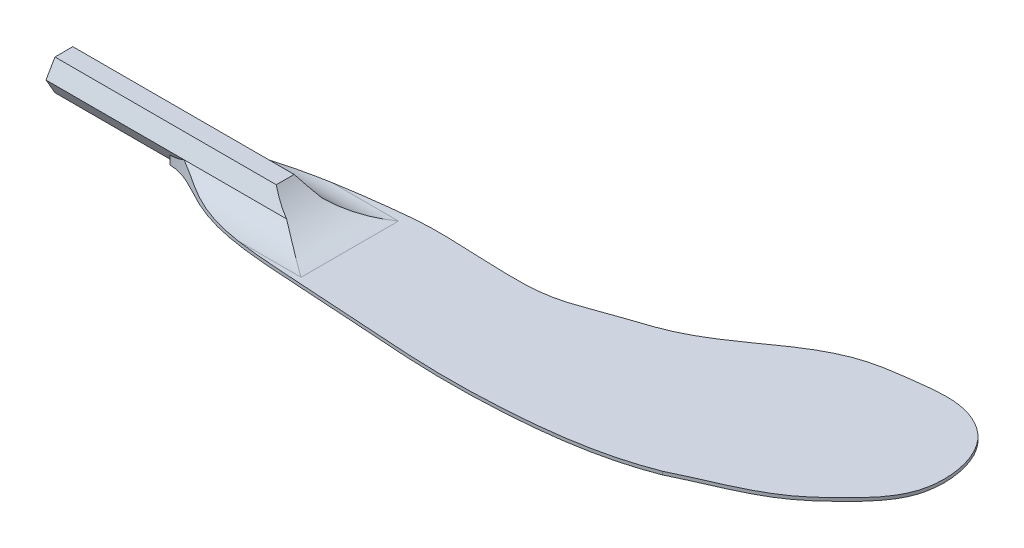
ISO-10303-21;
HEADER;
FILE_DESCRIPTION(('STEP AP214'),'2;1');
FILE_NAME('part.step','',(''),(''),'','','');
FILE_SCHEMA(('AUTOMOTIVE_DESIGN { 1 0 10303 214 1 1 1 1 }'));
ENDSEC;
DATA;
#1=APPLICATION_CONTEXT('core data for automotive mechanical design processes');
#2=APPLICATION_PROTOCOL_DEFINITION('international standard','automotive_design',2000,#1);
#3=PRODUCT_CONTEXT('',#1,'mechanical');
#4=PRODUCT('Part','Part','',(#3));
#5=PRODUCT_RELATED_PRODUCT_CATEGORY('part','',(#4));
#6=PRODUCT_DEFINITION_FORMATION('','',#4);
#7=PRODUCT_DEFINITION_CONTEXT('part definition',#1,'design');
#8=PRODUCT_DEFINITION('design','',#6,#7);
#9=PRODUCT_DEFINITION_SHAPE('','',#8);
#10=(LENGTH_UNIT() NAMED_UNIT(*) SI_UNIT(.MILLI.,.METRE.));
#11=(NAMED_UNIT(*) PLANE_ANGLE_UNIT() SI_UNIT($,.RADIAN.));
#12=(NAMED_UNIT(*) SI_UNIT($,.STERADIAN.) SOLID_ANGLE_UNIT());
#13=UNCERTAINTY_MEASURE_WITH_UNIT(LENGTH_MEASURE(1.E-05),#10,'distance_accuracy_value','');
#14=(GEOMETRIC_REPRESENTATION_CONTEXT(3) GLOBAL_UNCERTAINTY_ASSIGNED_CONTEXT((#13)) GLOBAL_UNIT_ASSIGNED_CONTEXT((#10,
#11,#12)) REPRESENTATION_CONTEXT('',''));
#15=CARTESIAN_POINT('',(0.,0.,0.));
#16=DIRECTION('',(0.,0.,1.));
#17=DIRECTION('',(1.,0.,0.));
#18=AXIS2_PLACEMENT_3D('',#15,#16,#17);
#19=CARTESIAN_POINT('',(3.53291368522627,0.341439542192836,1.55375877546974));
#20=CARTESIAN_POINT('',(5.39941426554257,0.341439542192836,1.64072915160123));
#21=CARTESIAN_POINT('',(7.90143628621617,0.341439542192836,3.36792366022731));
#22=CARTESIAN_POINT('',(12.4204628212514,0.341439542192836,5.12689137095886));
#23=CARTESIAN_POINT('',(17.5429583024821,0.341439542192836,5.88041056402993));
#24=CARTESIAN_POINT('',(23.7272109064526,0.341439542192836,6.19484272639976));
#25=CARTESIAN_POINT('',(30.6743375831285,0.341439542192836,6.66145747400739));
#26=CARTESIAN_POINT('',(38.6993787811437,0.341439542192836,7.24573238124021));
#27=CARTESIAN_POINT('',(49.2665108613436,0.341439542192836,6.98259884214597));
#28=CARTESIAN_POINT('',(57.2028389027666,0.341439542192836,5.81101987603051));
#29=CARTESIAN_POINT('',(61.6938429800198,0.341439542192836,4.05910740886292));
#30=B_SPLINE_CURVE_WITH_KNOTS('',3,(#19,#20,#21,#22,#23,#24,#25,#26,#27,#28,#29),.UNSPECIFIED.,
.F.,.F.,(4,1,1,1,1,1,1,1,4),(0.,0.0900267413271805,0.151645245521543,0.244140319925647,
0.350435716533196,0.465443094241625,0.596636931396752,0.757598930507502,1.),.UNSPECIFIED.);
#31=DIRECTION('',(0.,-1.,0.));
#32=VECTOR('',#31,1.);
#33=SURFACE_OF_LINEAR_EXTRUSION('',#30,#32);
#34=CARTESIAN_POINT('',(3.53291368522627,-0.0185604578071639,1.55375877546974));
#35=CARTESIAN_POINT('',(5.39941426554257,-0.0185604578071639,1.64072915160123));
#36=CARTESIAN_POINT('',(7.90143628621617,-0.0185604578071639,3.36792366022731));
#37=CARTESIAN_POINT('',(12.4204628212514,-0.0185604578071639,5.12689137095886));
#38=CARTESIAN_POINT('',(17.5429583024821,-0.0185604578071639,5.88041056402993));
#39=CARTESIAN_POINT('',(23.7272109064526,-0.0185604578071639,6.19484272639976));
#40=CARTESIAN_POINT('',(30.6743375831285,-0.0185604578071639,6.66145747400739));
#41=CARTESIAN_POINT('',(38.6993787811437,-0.0185604578071639,7.24573238124021));
#42=CARTESIAN_POINT('',(49.2665108613436,-0.0185604578071639,6.98259884214597));
#43=CARTESIAN_POINT('',(57.2028389027666,-0.0185604578071639,5.81101987603051));
#44=CARTESIAN_POINT('',(61.6938429800198,-0.0185604578071639,4.05910740886292));
#45=B_SPLINE_CURVE_WITH_KNOTS('',3,(#34,#35,#36,#37,#38,#39,#40,#41,#42,#43,#44),.UNSPECIFIED.,
.F.,.F.,(4,1,1,1,1,1,1,1,4),(0.,0.0900267413271805,0.151645245521543,0.244140319925647,
0.350435716533196,0.465443094241625,0.596636931396752,0.757598930507502,1.),.UNSPECIFIED.);
#46=CARTESIAN_POINT('',(3.53291368522627,-0.0185604578071639,1.55375877546974));
#47=VERTEX_POINT('',#46);
#48=CARTESIAN_POINT('',(61.6938429800198,-0.0185604578071639,4.05910740886292));
#49=VERTEX_POINT('',#48);
#50=EDGE_CURVE('E304',#47,#49,#45,.T.);
#51=ORIENTED_EDGE('',*,*,#50,.T.);
#52=DIRECTION('',(0.,-1.,0.));
#53=VECTOR('',#52,1.);
#54=CARTESIAN_POINT('',(61.6938429800198,0.341439542192836,4.05910740886292));
#55=LINE('',#54,#53);
#56=CARTESIAN_POINT('',(61.6938429800198,0.341439542192836,4.05910740886292));
#57=VERTEX_POINT('',#56);
#58=EDGE_CURVE('E281',#57,#49,#55,.T.);
#59=ORIENTED_EDGE('',*,*,#58,.F.);
#60=CARTESIAN_POINT('',(3.53291368522627,0.341439542192836,1.55375877546974));
#61=CARTESIAN_POINT('',(5.39941426554257,0.341439542192836,1.64072915160123));
#62=CARTESIAN_POINT('',(7.90143628621617,0.341439542192836,3.36792366022731));
#63=CARTESIAN_POINT('',(12.4204628212514,0.341439542192836,5.12689137095886));
#64=CARTESIAN_POINT('',(17.5429583024821,0.341439542192836,5.88041056402993));
#65=CARTESIAN_POINT('',(23.7272109064526,0.341439542192836,6.19484272639976));
#66=CARTESIAN_POINT('',(30.6743375831285,0.341439542192836,6.66145747400739));
#67=CARTESIAN_POINT('',(38.6993787811437,0.341439542192836,7.24573238124021));
#68=CARTESIAN_POINT('',(49.2665108613436,0.341439542192836,6.98259884214597));
#69=CARTESIAN_POINT('',(57.2028389027666,0.341439542192836,5.81101987603051));
#70=CARTESIAN_POINT('',(61.6938429800198,0.341439542192836,4.05910740886292));
#71=B_SPLINE_CURVE_WITH_KNOTS('',3,(#60,#61,#62,#63,#64,#65,#66,#67,#68,#69,#70),.UNSPECIFIED.,
.F.,.F.,(4,1,1,1,1,1,1,1,4),(0.,0.0900267413271805,0.151645245521543,0.244140319925647,
0.350435716533196,0.465443094241625,0.596636931396752,0.757598930507502,1.),.UNSPECIFIED.);
#72=CARTESIAN_POINT('',(15.1787100310029,0.341439542192836,5.49945586555571));
#73=VERTEX_POINT('',#72);
#74=EDGE_CURVE('E303',#73,#57,#71,.T.);
#75=ORIENTED_EDGE('',*,*,#74,.F.);
#76=CARTESIAN_POINT('',(15.1787100310029,0.341439542192836,5.49945588494075));
#77=CARTESIAN_POINT('',(14.9369451631756,0.34146528144871,5.46312382434842));
#78=CARTESIAN_POINT('',(14.6955381728055,0.341837499258173,5.42424451689249));
#79=CARTESIAN_POINT('',(14.2121798050201,0.343787108050494,5.34035137697904));
#80=CARTESIAN_POINT('',(13.9702351368796,0.345372339265865,5.29529920803922));
#81=CARTESIAN_POINT('',(13.4867027141693,0.350283304427853,5.19827323039414));
#82=CARTESIAN_POINT('',(13.2451205823206,0.353616215614986,5.14627154309321));
#83=CARTESIAN_POINT('',(12.7632167564122,0.362778893452468,5.03459546431482));
#84=CARTESIAN_POINT('',(12.5228988982682,0.368614022930859,4.97490478691018));
#85=CARTESIAN_POINT('',(12.1640959952666,0.379967028911623,4.87911886053269));
#86=CARTESIAN_POINT('',(12.044734085144,0.384186609372266,4.8461364029791));
#87=CARTESIAN_POINT('',(11.806672142105,0.393643330401688,4.77800213366466));
#88=CARTESIAN_POINT('',(11.6879721076803,0.398880468650612,4.74285032684968));
#89=CARTESIAN_POINT('',(11.3393798741714,0.416021395863283,4.63611111005854));
#90=CARTESIAN_POINT('',(11.1104799641424,0.429546366334039,4.56150120669107));
#91=CARTESIAN_POINT('',(10.6562353169275,0.462186656667865,4.404319610403));
#92=CARTESIAN_POINT('',(10.4308855922373,0.481293225673827,4.32176051507684));
#93=CARTESIAN_POINT('',(9.98435888209029,0.526460811213078,4.14891959534867));
#94=CARTESIAN_POINT('',(9.76317452135914,0.552507990081301,4.05865337754663));
#95=CARTESIAN_POINT('',(9.43493804339931,0.597980944627686,3.91767650667825));
#96=CARTESIAN_POINT('',(9.32621053197103,0.614188465170574,3.86979944417612));
#97=CARTESIAN_POINT('',(9.10996105899729,0.648967010393182,3.77220792828809));
#98=CARTESIAN_POINT('',(9.00243909375775,0.667538027828464,3.72249348053437));
#99=CARTESIAN_POINT('',(8.78880420960102,0.707253361554784,3.62135283740014));
#100=CARTESIAN_POINT('',(8.68269009966852,0.728395325443997,3.56992823764429));
#101=CARTESIAN_POINT('',(8.47194150509967,0.773549749283594,3.46534243962358));
#102=CARTESIAN_POINT('',(8.36730696236,0.797562096160577,3.41218130982602));
#103=CARTESIAN_POINT('',(8.20702073613036,0.836844340402017,3.32928012085425));
#104=CARTESIAN_POINT('',(8.15089029906051,0.851079420660115,3.29996818924624));
#105=CARTESIAN_POINT('',(8.03897269711666,0.880389756127177,3.2411121946214));
#106=CARTESIAN_POINT('',(7.98318552710778,0.895464998734213,3.21156813509206));
#107=CARTESIAN_POINT('',(7.81621273536111,0.941947284058292,3.12270760103838));
#108=CARTESIAN_POINT('',(7.70547590772666,0.974596104706496,3.06319412244769));
#109=CARTESIAN_POINT('',(7.48475684950877,1.0430106117562,2.94441974081504));
#110=CARTESIAN_POINT('',(7.37477504827202,1.07877793492993,2.88515898774167));
#111=CARTESIAN_POINT('',(7.15516617356948,1.15311375401131,2.76765027261449));
#112=CARTESIAN_POINT('',(7.04553923357599,1.191683199159,2.70940266213032));
#113=CARTESIAN_POINT('',(6.82494981151547,1.27164829331985,2.59398121407864));
#114=CARTESIAN_POINT('',(6.71398667029754,1.31307166612959,2.53682783345902));
#115=CARTESIAN_POINT('',(6.49152603086341,1.39774088418139,2.42501882377477));
#116=CARTESIAN_POINT('',(6.38002863468412,1.4409863928188,2.3703627372377));
#117=CARTESIAN_POINT('',(6.15596566828314,1.52856305881932,2.26423084573464));
#118=CARTESIAN_POINT('',(6.04340026450241,1.5728940486668,2.21275455431625));
#119=CARTESIAN_POINT('',(5.81658792193022,1.66164046599276,2.11366418778183));
#120=CARTESIAN_POINT('',(5.70234062950198,1.70605590946833,2.06605093902475));
#121=CARTESIAN_POINT('',(5.58697797019266,1.74999999999998,2.02072594216369));
#122=B_SPLINE_CURVE_WITH_KNOTS('',3,(#76,#77,#78,#79,#80,#81,#82,#83,#84,#85,#86,#87,#88,#89,
#90,#91,#92,#93,#94,#95,#96,#97,#98,#99,#100,#101,#102,#103,#104,#105,#106,#107,#108,#109,#110,
#111,#112,#113,#114,#115,#116,#117,#118,#119,#120,#121),.UNSPECIFIED.,.F.,.F.,(4,2,2,2,2,2,2,2,
2,2,2,2,2,2,2,2,2,2,2,2,2,2,4),(0.,0.733462587294985,1.47170632808826,2.21300585495784,
2.95590216045808,3.32760080105219,3.69929859424786,4.42247005799354,5.14451375972777,
5.86512853865457,6.2248000418093,6.58447044254866,6.94381418870903,7.30314378385256,
7.49784802670434,7.69254934989557,8.08215999381333,8.47197637352255,8.86192542781425,
9.25642412018026,9.65085025327558,10.0452158959464,10.4396656777448),.UNSPECIFIED.);
#123=CARTESIAN_POINT('',(5.58697797019266,1.75,2.02072594216369));
#124=VERTEX_POINT('',#123);
#125=EDGE_CURVE('E13',#73,#124,#122,.T.);
#126=ORIENTED_EDGE('',*,*,#125,.T.);
#127=CARTESIAN_POINT('',(3.53291368522627,0.941189141819591,1.55375877546974));
#128=CARTESIAN_POINT('',(3.59543305588993,0.94622302491239,1.55666508922844));
#129=CARTESIAN_POINT('',(3.65773996975377,0.95312099046087,1.56064763149471));
#130=CARTESIAN_POINT('',(3.78155309702697,0.970444259744832,1.57064922567905));
#131=CARTESIAN_POINT('',(3.84306080812325,0.980861512916611,1.57666362960199));
#132=CARTESIAN_POINT('',(3.96514521444621,1.00503899381283,1.59062250470575));
#133=CARTESIAN_POINT('',(4.0257225039358,1.01879698461027,1.59856568439616));
#134=CARTESIAN_POINT('',(4.14465787333648,1.04912404911706,1.61607502325289));
#135=CARTESIAN_POINT('',(4.20303622157024,1.06563380118447,1.62560693305326));
#136=CARTESIAN_POINT('',(4.31868468462971,1.10140367980085,1.64625868210131));
#137=CARTESIAN_POINT('',(4.37595426724918,1.12066509171229,1.65737926345335));
#138=CARTESIAN_POINT('',(4.4892916276035,1.16167814730461,1.68105816213987));
#139=CARTESIAN_POINT('',(4.54535932191683,1.18342996318102,1.69361657889148));
#140=CARTESIAN_POINT('',(4.65895402153378,1.23028226385697,1.72066676729889));
#141=CARTESIAN_POINT('',(4.71641962448426,1.25549408460679,1.73522281879556));
#142=CARTESIAN_POINT('',(4.82999505471103,1.30810042006202,1.76559510073171));
#143=CARTESIAN_POINT('',(4.88610493236258,1.3354948535041,1.7814112842538));
#144=CARTESIAN_POINT('',(4.99702387155884,1.39222097814944,1.81416212758787));
#145=CARTESIAN_POINT('',(5.0518325038395,1.42155329688921,1.83109714970823));
#146=CARTESIAN_POINT('',(5.16135011081192,1.48256404527109,1.86632172170997));
#147=CARTESIAN_POINT('',(5.21603163005334,1.51427934750188,1.88463255999034));
#148=CARTESIAN_POINT('',(5.32412836346559,1.57924537963931,1.92214071613307));
#149=CARTESIAN_POINT('',(5.37754406721048,1.61249550076315,1.94133768251451));
#150=CARTESIAN_POINT('',(5.48314340425081,1.68030474488703,1.98048736786298));
#151=CARTESIAN_POINT('',(5.53532863226439,1.71486200306757,2.00043901017597));
#152=CARTESIAN_POINT('',(5.58697797019266,1.75,2.02072594216369));
#153=B_SPLINE_CURVE_WITH_KNOTS('',3,(#127,#128,#129,#130,#131,#132,#133,#134,#135,#136,#137,
#138,#139,#140,#141,#142,#143,#144,#145,#146,#147,#148,#149,#150,#151,#152),.UNSPECIFIED.,.F.,
.F.,(4,2,2,2,2,2,2,2,2,2,2,2,4),(0.,0.188312121257183,0.376196352705403,0.563955123854209,
0.748093351599173,0.932317877444668,1.11655514894074,1.3097415122383,1.5029206861532,
1.6961627259559,1.89355770094953,2.09087504135677,2.28792077758922),.UNSPECIFIED.);
#154=CARTESIAN_POINT('',(3.53291368522627,0.941189141819591,1.55375877546974));
#155=VERTEX_POINT('',#154);
#156=EDGE_CURVE('E235',#155,#124,#153,.T.);
#157=ORIENTED_EDGE('',*,*,#156,.F.);
#158=DIRECTION('',(0.,-1.,0.));
#159=VECTOR('',#158,1.);
#160=CARTESIAN_POINT('',(3.53291368522627,0.341439542192836,1.55375877546974));
#161=LINE('',#160,#159);
#162=EDGE_CURVE('E68',#155,#47,#161,.T.);
#163=ORIENTED_EDGE('',*,*,#162,.T.);
#164=EDGE_LOOP('',(#51,#59,#75,#126,#157,#163));
#165=FACE_BOUND('',#164,.T.);
#166=ADVANCED_FACE('F47',(#165),#33,.F.);
#167=CARTESIAN_POINT('',(61.6938429800198,0.341439542192836,4.05910740886292));
#168=CARTESIAN_POINT('',(64.8026668773981,0.341439542192836,2.50690764307333));
#169=CARTESIAN_POINT('',(69.7534318020435,0.341439542192836,0.871467797706562));
#170=CARTESIAN_POINT('',(74.7745413929973,0.341439542192836,-3.7529783722523));
#171=CARTESIAN_POINT('',(78.2236720765815,0.341439542192836,-7.46428436941587));
#172=CARTESIAN_POINT('',(78.6157338115274,0.341439542192836,-12.7720772232604));
#173=CARTESIAN_POINT('',(76.7495048197811,0.341439542192836,-17.3108904955803));
#174=CARTESIAN_POINT('',(72.1044548495168,0.341439542192836,-19.643512548254));
#175=CARTESIAN_POINT('',(67.1424145966671,0.341439542192836,-19.0052573895129));
#176=CARTESIAN_POINT('',(62.1380162266281,0.341439542192836,-18.3770275017326));
#177=CARTESIAN_POINT('',(57.6636447792491,0.341439542192836,-16.1238831544614));
#178=CARTESIAN_POINT('',(53.5304999416177,0.341439542192836,-13.0359798810454));
#179=CARTESIAN_POINT('',(48.790783239302,0.341439542192836,-9.95664411151373));
#180=CARTESIAN_POINT('',(43.498923058119,0.341439542192836,-8.50361250610061));
#181=CARTESIAN_POINT('',(38.6653299406295,0.341439542192836,-6.47195159489416));
#182=CARTESIAN_POINT('',(33.8734138204924,0.341439542192836,-6.38295958469405));
#183=CARTESIAN_POINT('',(29.0208646525773,0.341439542192836,-6.59787939815207));
#184=CARTESIAN_POINT('',(24.3456158567557,0.341439542192836,-6.80159143115289));
#185=CARTESIAN_POINT('',(18.935417002511,0.341439542192836,-6.12899036139769));
#186=CARTESIAN_POINT('',(13.4884934842083,0.341439542192836,-5.43552928228275));
#187=CARTESIAN_POINT('',(7.28944508193513,0.341439542192836,-3.54900329936592));
#188=CARTESIAN_POINT('',(5.06983131710176,0.341439542192836,0.109613943466216));
#189=CARTESIAN_POINT('',(3.53291368522627,0.341439542192836,1.55375877546974));
#190=B_SPLINE_CURVE_WITH_KNOTS('',3,(#167,#168,#169,#170,#171,#172,#173,#174,#175,#176,#177,
#178,#179,#180,#181,#182,#183,#184,#185,#186,#187,#188,#189),.UNSPECIFIED.,.F.,.F.,(4,1,1,1,1,1,
1,1,1,1,1,1,1,1,1,1,1,1,1,1,4),(0.,0.0974642921306581,0.137999524964852,0.189052913166759,
0.231454212882584,0.278046937109444,0.315806508366648,0.365503135074344,0.41329860830154,
0.454710288246978,0.501723778682879,0.556359120756823,0.609108798668175,0.652642006451504,
0.699907488376101,0.739412241100897,0.787367277054301,0.828789936955284,0.88944590768763,
0.940766344114541,1.),.UNSPECIFIED.);
#191=DIRECTION('',(0.,-1.,0.));
#192=VECTOR('',#191,1.);
#193=SURFACE_OF_LINEAR_EXTRUSION('',#190,#192);
#194=ORIENTED_EDGE('',*,*,#162,.F.);
#195=CARTESIAN_POINT('',(-0.706873580614924,7.84143954218053,5.53762020159395));
#196=CARTESIAN_POINT('',(-0.553407576051596,7.5916737419683,5.39341784960706));
#197=CARTESIAN_POINT('',(-0.399941571530234,7.34190794173683,5.24921549760906));
#198=CARTESIAN_POINT('',(-0.0929657233872509,6.84230499317308,4.96076960076784));
#199=CARTESIAN_POINT('',(0.0605441202343703,6.5924678448408,4.81652605592464));
#200=CARTESIAN_POINT('',(0.367596655663325,6.09274008795538,4.52800810096531));
#201=CARTESIAN_POINT('',(0.521139347470676,5.84284947940224,4.3837336908492));
#202=CARTESIAN_POINT('',(0.828246587852476,5.34303268972381,4.09516433278286));
#203=CARTESIAN_POINT('',(0.981811136426877,5.09310650859849,3.95086938483262));
#204=CARTESIAN_POINT('',(1.28895110094078,4.59323646234944,3.6622692790709));
#205=CARTESIAN_POINT('',(1.44252651688037,4.34329259722574,3.51796412125944));
#206=CARTESIAN_POINT('',(1.74960362180684,3.84352484771846,3.22942307654911));
#207=CARTESIAN_POINT('',(1.90310531079599,3.59370096333592,3.08518718965085));
#208=CARTESIAN_POINT('',(2.13335306823404,3.21897293723382,2.86883786290791));
#209=CARTESIAN_POINT('',(2.21009913010095,3.09406879249512,2.79672442132013));
#210=CARTESIAN_POINT('',(2.36359146658167,2.84426010675782,2.65249730936378));
#211=CARTESIAN_POINT('',(2.44033774119541,2.71935556575918,2.5803836389952));
#212=CARTESIAN_POINT('',(2.59382130869016,2.4695612924242,2.43616484804326));
#213=CARTESIAN_POINT('',(2.67055860156036,2.3446715600829,2.36405972745702));
#214=CARTESIAN_POINT('',(2.82403196200611,2.09489337608905,2.21985022569036));
#215=CARTESIAN_POINT('',(2.9007680295856,1.97000492443832,2.14774584451098));
#216=CARTESIAN_POINT('',(3.05422611279376,1.72025355353283,2.00355182328866));
#217=CARTESIAN_POINT('',(3.13094812816748,1.59539063416112,1.93146218317821));
#218=CARTESIAN_POINT('',(3.24602921731419,1.4080919508374,1.82332523794115));
#219=CARTESIAN_POINT('',(3.28439007697632,1.34565700607029,1.78727840577224));
#220=CARTESIAN_POINT('',(3.361118322083,1.22079006894702,1.71518644601362));
#221=CARTESIAN_POINT('',(3.39948570753088,1.15835807659241,1.67914131842478));
#222=CARTESIAN_POINT('',(3.45701633747011,1.06470451195308,1.6250704076632));
#223=CARTESIAN_POINT('',(3.47618889525965,1.03348721166546,1.60704709093473));
#224=CARTESIAN_POINT('',(3.51456798030838,0.971068242616772,1.57100948236433));
#225=CARTESIAN_POINT('',(3.53377450752528,0.939866573836315,1.55299519051121));
#226=CARTESIAN_POINT('',(3.5719789155019,0.877368154911915,1.51691171147601));
#227=CARTESIAN_POINT('',(3.59097680030074,0.846071406623645,1.49884252536532));
#228=CARTESIAN_POINT('',(3.62876582710775,0.783384551802595,1.4626502530284));
#229=CARTESIAN_POINT('',(3.64755696919305,0.751994445304642,1.44452716682227));
#230=CARTESIAN_POINT('',(3.7036334217736,0.657698623658499,1.39008544786742));
#231=CARTESIAN_POINT('',(3.74062517404757,0.594661812173278,1.35369112497849));
#232=CARTESIAN_POINT('',(3.81389262856427,0.468275967389098,1.28072223034741));
#233=CARTESIAN_POINT('',(3.85016831975591,0.40492692929032,1.24414765583426));
#234=CARTESIAN_POINT('',(3.90217041181942,0.313089728158821,1.19112541656321));
#235=CARTESIAN_POINT('',(3.91815817667451,0.28471232430272,1.17474170998471));
#236=CARTESIAN_POINT('',(3.95000913882142,0.227904621662735,1.14194376392328));
#237=CARTESIAN_POINT('',(3.96587233435804,0.199474322140493,1.12552952401415));
#238=CARTESIAN_POINT('',(4.01328227049816,0.114108961289023,1.07624381190286));
#239=CARTESIAN_POINT('',(4.04464953162421,0.0570991354451165,1.04332917282431));
#240=CARTESIAN_POINT('',(4.18494354849476,-0.200071116648601,0.894851856196101));
#241=CARTESIAN_POINT('',(4.29141197436171,-0.401238731381398,0.778707681018699));
#242=CARTESIAN_POINT('',(4.5005519028111,-0.805048265183303,0.54556813895844));
#243=CARTESIAN_POINT('',(4.60322321382693,-1.00769025802009,0.428572729485711));
#244=CARTESIAN_POINT('',(4.80612601077612,-1.41393057937904,0.194029770330359));
#245=CARTESIAN_POINT('',(4.90635703045809,-1.61752908192711,0.0764821201739277));
#246=CARTESIAN_POINT('',(5.10558887012316,-2.02521026275138,-0.158892719248001));
#247=CARTESIAN_POINT('',(5.20458950504987,-2.22929300849215,-0.2767199474642));
#248=CARTESIAN_POINT('',(5.40249705011422,-2.63749907147944,-0.512397827833647));
#249=CARTESIAN_POINT('',(5.5014039576284,-2.84162238967879,-0.630248480537006));
#250=CARTESIAN_POINT('',(5.70025942723848,-3.24948974941566,-0.865730810469686));
#251=CARTESIAN_POINT('',(5.8002079893985,-3.45323379092983,-0.983362487685527));
#252=CARTESIAN_POINT('',(6.00231334346203,-3.85986839262102,-1.21813308443511));
#253=CARTESIAN_POINT('',(6.10446981566587,-4.06275907134733,-1.33527207241332));
#254=CARTESIAN_POINT('',(6.31228045114409,-4.46718438089105,-1.56876713374512));
#255=CARTESIAN_POINT('',(6.41793441454046,-4.6687190884115,-1.68512325138323));
#256=CARTESIAN_POINT('',(6.63422817452982,-5.06986174999295,-1.91672307503082));
#257=CARTESIAN_POINT('',(6.74486943863145,-5.26946911567872,-2.03196644134169));
#258=CARTESIAN_POINT('',(6.91589079139351,-5.56683763157523,-2.20365223404305));
#259=CARTESIAN_POINT('',(6.97377501668754,-5.66567487223084,-2.26071594154153));
#260=CARTESIAN_POINT('',(7.09147376662768,-5.8624931212978,-2.37434901062177));
#261=CARTESIAN_POINT('',(7.15128845107111,-5.96047405796952,-2.43091833078464));
#262=CARTESIAN_POINT('',(7.21219429399508,-6.05795027825334,-2.48719625280509));
#263=B_SPLINE_CURVE_WITH_KNOTS('',3,(#195,#196,#197,#198,#199,#200,#201,#202,#203,#204,#205,
#206,#207,#208,#209,#210,#211,#212,#213,#214,#215,#216,#217,#218,#219,#220,#221,#222,#223,#224,
#225,#226,#227,#228,#229,#230,#231,#232,#233,#234,#235,#236,#237,#238,#239,#240,#241,#242,#243,
#244,#245,#246,#247,#248,#249,#250,#251,#252,#253,#254,#255,#256,#257,#258,#259,#260,#261,#262),
.UNSPECIFIED.,.F.,.F.,(4,2,2,2,2,2,2,2,2,2,2,2,2,2,2,2,2,2,2,2,2,2,2,2,2,2,2,2,2,2,2,2,2,4),(0.,
0.980082542685647,1.96044505575948,2.94101734722137,3.9217292250712,4.90251049730887,
5.88282095591158,6.37294559980679,6.86307175547662,7.35313996656899,7.84320253665454,
8.33316721492883,8.57816001482396,8.82315294009592,8.94563775946551,9.06812242645493,
9.19060471806633,9.31308696399016,9.55802953611539,9.80297588552907,9.91235485194162,
10.0217353567805,10.2404952006166,11.0070133955589,11.7735702091722,12.5402723525907,
13.3070884494933,14.0739254107143,14.8407624191379,15.6074891257286,16.3741720900659,
17.1410821418998,17.5249677420151,17.9088852008843),.UNSPECIFIED.);
#264=CARTESIAN_POINT('',(4.07579880495196,0.,1.01036297353952));
#265=VERTEX_POINT('',#264);
#266=EDGE_CURVE('E202',#155,#265,#263,.T.);
#267=ORIENTED_EDGE('',*,*,#266,.T.);
#268=CARTESIAN_POINT('',(61.6938429800198,0.,4.05910740886292));
#269=CARTESIAN_POINT('',(64.8026668773981,0.,2.50690764307333));
#270=CARTESIAN_POINT('',(69.7534318020435,0.,0.871467797706562));
#271=CARTESIAN_POINT('',(74.7745413929973,0.,-3.7529783722523));
#272=CARTESIAN_POINT('',(78.2236720765815,0.,-7.46428436941587));
#273=CARTESIAN_POINT('',(78.6157338115274,0.,-12.7720772232604));
#274=CARTESIAN_POINT('',(76.7495048197811,0.,-17.3108904955803));
#275=CARTESIAN_POINT('',(72.1044548495168,0.,-19.643512548254));
#276=CARTESIAN_POINT('',(67.1424145966671,0.,-19.0052573895129));
#277=CARTESIAN_POINT('',(62.1380162266281,0.,-18.3770275017326));
#278=CARTESIAN_POINT('',(57.6636447792491,0.,-16.1238831544614));
#279=CARTESIAN_POINT('',(53.5304999416177,0.,-13.0359798810454));
#280=CARTESIAN_POINT('',(48.790783239302,0.,-9.95664411151373));
#281=CARTESIAN_POINT('',(43.498923058119,0.,-8.50361250610061));
#282=CARTESIAN_POINT('',(38.6653299406295,0.,-6.47195159489416));
#283=CARTESIAN_POINT('',(33.8734138204924,0.,-6.38295958469405));
#284=CARTESIAN_POINT('',(29.0208646525773,0.,-6.59787939815207));
#285=CARTESIAN_POINT('',(24.3456158567557,0.,-6.80159143115289));
#286=CARTESIAN_POINT('',(18.935417002511,0.,-6.12899036139769));
#287=CARTESIAN_POINT('',(13.4884934842083,0.,-5.43552928228275));
#288=CARTESIAN_POINT('',(7.28944508193513,0.,-3.54900329936592));
#289=CARTESIAN_POINT('',(5.06983131710176,0.,0.109613943466216));
#290=CARTESIAN_POINT('',(3.53291368522627,0.,1.55375877546974));
#291=B_SPLINE_CURVE_WITH_KNOTS('',3,(#268,#269,#270,#271,#272,#273,#274,#275,#276,#277,#278,
#279,#280,#281,#282,#283,#284,#285,#286,#287,#288,#289,#290),.UNSPECIFIED.,.F.,.F.,(4,1,1,1,1,1,
1,1,1,1,1,1,1,1,1,1,1,1,1,1,4),(0.,0.0974642921306581,0.137999524964852,0.189052913166759,
0.231454212882584,0.278046937109444,0.315806508366648,0.365503135074344,0.41329860830154,
0.454710288246978,0.501723778682879,0.556359120756823,0.609108798668175,0.652642006451504,
0.699907488376101,0.739412241100897,0.787367277054301,0.828789936955284,0.88944590768763,
0.940766344114541,1.),.UNSPECIFIED.);
#292=CARTESIAN_POINT('',(5.82370004147955,0.,-1.01036297192607));
#293=VERTEX_POINT('',#292);
#294=EDGE_CURVE('E278',#265,#293,#291,.F.);
#295=ORIENTED_EDGE('',*,*,#294,.T.);
#296=CARTESIAN_POINT('',(5.8237000407573,0.,-1.01036297108184));
#297=CARTESIAN_POINT('',(5.85183895801367,0.0569707574378857,-1.04325505322454));
#298=CARTESIAN_POINT('',(5.88005324403885,0.113913168141818,-1.07613076937277));
#299=CARTESIAN_POINT('',(5.93665767629064,0.227729469669939,-1.1418426416982));
#300=CARTESIAN_POINT('',(5.96504781487357,0.284603363345727,-1.17467879952177));
#301=CARTESIAN_POINT('',(6.11218264440913,0.578111295253258,-1.34413568301788));
#302=CARTESIAN_POINT('',(6.23258915087032,0.814129109446707,-1.48040063157601));
#303=CARTESIAN_POINT('',(6.417443074984,1.16651231708303,-1.68384917136275));
#304=CARTESIAN_POINT('',(6.47977399202922,1.28370954528195,-1.75151302261167));
#305=CARTESIAN_POINT('',(6.60615995073767,1.51741163502336,-1.88644098703405));
#306=CARTESIAN_POINT('',(6.67021508479186,1.63391645905387,-1.95370507854996));
#307=CARTESIAN_POINT('',(6.73528524172614,1.74999999998009,-2.0207259421522));
#308=B_SPLINE_CURVE_WITH_KNOTS('',3,(#296,#297,#298,#299,#300,#301,#302,#303,#304,#305,#306,
#307),.UNSPECIFIED.,.F.,.F.,(4,2,2,2,2,4),(0.,0.214648007104799,0.42928674881307,
1.3230647342376,1.77003114699462,2.21702155799933),.UNSPECIFIED.);
#309=CARTESIAN_POINT('',(6.73528524172614,1.75,-2.02072594216369));
#310=VERTEX_POINT('',#309);
#311=EDGE_CURVE('E184',#293,#310,#308,.T.);
#312=ORIENTED_EDGE('',*,*,#311,.T.);
#313=CARTESIAN_POINT('',(6.73528524172614,1.75,-2.02072594216369));
#314=CARTESIAN_POINT('',(6.79755381576907,1.68787830280723,-2.08484750219462));
#315=CARTESIAN_POINT('',(6.86168272346696,1.62839546477588,-2.1497066512661));
#316=CARTESIAN_POINT('',(6.99365074713735,1.51469660347893,-2.28021647770554));
#317=CARTESIAN_POINT('',(7.06148890129273,1.46047922489431,-2.34586694647255));
#318=CARTESIAN_POINT('',(7.20089242919799,1.35727179355614,-2.47730515065436));
#319=CARTESIAN_POINT('',(7.27245755324183,1.30828139126529,-2.54309287659017));
#320=CARTESIAN_POINT('',(7.41764364390547,1.21650905816964,-2.67260237735011));
#321=CARTESIAN_POINT('',(7.49117944292716,1.17361022975899,-2.7363368628043));
#322=CARTESIAN_POINT('',(7.64181462175944,1.09259709949473,-2.86260855843126));
#323=CARTESIAN_POINT('',(7.71891363325205,1.05448230463742,-2.92514589140902));
#324=CARTESIAN_POINT('',(7.8766739384364,0.982884160447774,-3.04831947548114));
#325=CARTESIAN_POINT('',(7.95733469375864,0.94940011430232,-3.10895601153417));
#326=CARTESIAN_POINT('',(8.14300858099469,0.878817252659305,-3.24288543443822));
#327=CARTESIAN_POINT('',(8.24900082243751,0.842962544056431,-3.31547829564406));
#328=CARTESIAN_POINT('',(8.46556017151836,0.777183729903266,-3.45651095240522));
#329=CARTESIAN_POINT('',(8.57613006439204,0.747263301074507,-3.52494815512151));
#330=CARTESIAN_POINT('',(8.80110081263308,0.69254511065707,-3.65746724488074));
#331=CARTESIAN_POINT('',(8.91550253379177,0.667748515983078,-3.72154813758205));
#332=CARTESIAN_POINT('',(9.14936234422305,0.622142743428025,-3.84636073767272));
#333=CARTESIAN_POINT('',(9.2688725098593,0.601405340755236,-3.9070206097897));
#334=CARTESIAN_POINT('',(9.51054245489146,0.563713904036167,-4.02395249773363));
#335=CARTESIAN_POINT('',(9.63270133457874,0.546758606717052,-4.08022597457623));
#336=CARTESIAN_POINT('',(9.87919652093039,0.515999449360337,-4.1886177736925));
#337=CARTESIAN_POINT('',(10.0035323809442,0.502194950846117,-4.24073693639921));
#338=CARTESIAN_POINT('',(10.3155498698373,0.47104707582935,-4.36576868991816));
#339=CARTESIAN_POINT('',(10.5043389958787,0.455297566284601,-4.43631543571182));
#340=CARTESIAN_POINT('',(10.8849490136924,0.428145257076489,-4.56984723910289));
#341=CARTESIAN_POINT('',(11.0767713792752,0.416744642570597,-4.63282848445908));
#342=CARTESIAN_POINT('',(11.4628125571174,0.397204295926166,-4.7523243888972));
#343=CARTESIAN_POINT('',(11.6570338996665,0.389068376123928,-4.80883143308025));
#344=CARTESIAN_POINT('',(12.0472527813909,0.375254365695104,-4.91640845054899));
#345=CARTESIAN_POINT('',(12.2432518673291,0.369578678483284,-4.96747307054978));
#346=CARTESIAN_POINT('',(12.6281478986482,0.360297234353399,-5.06307301714816));
#347=CARTESIAN_POINT('',(12.81699772249,0.356614608643758,-5.10779241677573));
#348=CARTESIAN_POINT('',(13.195271230585,0.350589732814335,-5.19404443558175));
#349=CARTESIAN_POINT('',(13.3846942887899,0.348246343319489,-5.23557973754776));
#350=CARTESIAN_POINT('',(13.7637125042432,0.344654670736443,-5.31574054149655));
#351=CARTESIAN_POINT('',(13.9533062849843,0.343403903589775,-5.35437246039532));
#352=CARTESIAN_POINT('',(14.3322872965874,0.341800853380002,-5.42888175192022));
#353=CARTESIAN_POINT('',(14.5216725546619,0.341445159811531,-5.46476907362913));
#354=CARTESIAN_POINT('',(14.7112733613147,0.341439542192836,-5.49945588562186));
#355=B_SPLINE_CURVE_WITH_KNOTS('',3,(#313,#314,#315,#316,#317,#318,#319,#320,#321,#322,#323,
#324,#325,#326,#327,#328,#329,#330,#331,#332,#333,#334,#335,#336,#337,#338,#339,#340,#341,#342,
#343,#344,#345,#346,#347,#348,#349,#350,#351,#352,#353,#354),.UNSPECIFIED.,.F.,.F.,(4,2,2,2,2,2,
2,2,2,2,2,2,2,2,2,2,2,2,2,2,4),(0.,0.326485988898329,0.652887716963086,0.979267604258975,
1.29813921211759,1.61697793262731,1.93576862347291,2.33557976784276,2.73563785598688,
3.13578695417764,3.54247450833283,3.94902601942248,4.3554950737888,4.96168051111987,
5.56817013406462,6.17536593648074,6.78315358227189,7.36543564854818,7.94722158942536,
8.52768138146763,9.10592607129811),.UNSPECIFIED.);
#356=CARTESIAN_POINT('',(14.7112733615876,0.341439542192836,-5.49945588567181));
#357=VERTEX_POINT('',#356);
#358=EDGE_CURVE('E242',#310,#357,#355,.T.);
#359=ORIENTED_EDGE('',*,*,#358,.T.);
#360=CARTESIAN_POINT('',(61.6938429800198,0.341439542192836,4.05910740886292));
#361=CARTESIAN_POINT('',(64.8026668773981,0.341439542192836,2.50690764307333));
#362=CARTESIAN_POINT('',(69.7534318020435,0.341439542192836,0.871467797706562));
#363=CARTESIAN_POINT('',(74.7745413929973,0.341439542192836,-3.7529783722523));
#364=CARTESIAN_POINT('',(78.2236720765815,0.341439542192836,-7.46428436941587));
#365=CARTESIAN_POINT('',(78.6157338115274,0.341439542192836,-12.7720772232604));
#366=CARTESIAN_POINT('',(76.7495048197811,0.341439542192836,-17.3108904955803));
#367=CARTESIAN_POINT('',(72.1044548495168,0.341439542192836,-19.643512548254));
#368=CARTESIAN_POINT('',(67.1424145966671,0.341439542192836,-19.0052573895129));
#369=CARTESIAN_POINT('',(62.1380162266281,0.341439542192836,-18.3770275017326));
#370=CARTESIAN_POINT('',(57.6636447792491,0.341439542192836,-16.1238831544614));
#371=CARTESIAN_POINT('',(53.5304999416177,0.341439542192836,-13.0359798810454));
#372=CARTESIAN_POINT('',(48.790783239302,0.341439542192836,-9.95664411151373));
#373=CARTESIAN_POINT('',(43.498923058119,0.341439542192836,-8.50361250610061));
#374=CARTESIAN_POINT('',(38.6653299406295,0.341439542192836,-6.47195159489416));
#375=CARTESIAN_POINT('',(33.8734138204924,0.341439542192836,-6.38295958469405));
#376=CARTESIAN_POINT('',(29.0208646525773,0.341439542192836,-6.59787939815207));
#377=CARTESIAN_POINT('',(24.3456158567557,0.341439542192836,-6.80159143115289));
#378=CARTESIAN_POINT('',(18.935417002511,0.341439542192836,-6.12899036139769));
#379=CARTESIAN_POINT('',(13.4884934842083,0.341439542192836,-5.43552928228275));
#380=CARTESIAN_POINT('',(7.28944508193513,0.341439542192836,-3.54900329936592));
#381=CARTESIAN_POINT('',(5.06983131710176,0.341439542192836,0.109613943466216));
#382=CARTESIAN_POINT('',(3.53291368522627,0.341439542192836,1.55375877546974));
#383=B_SPLINE_CURVE_WITH_KNOTS('',3,(#360,#361,#362,#363,#364,#365,#366,#367,#368,#369,#370,
#371,#372,#373,#374,#375,#376,#377,#378,#379,#380,#381,#382),.UNSPECIFIED.,.F.,.F.,(4,1,1,1,1,1,
1,1,1,1,1,1,1,1,1,1,1,1,1,1,4),(0.,0.0974642921306581,0.137999524964852,0.189052913166759,
0.231454212882584,0.278046937109444,0.315806508366648,0.365503135074344,0.41329860830154,
0.454710288246978,0.501723778682879,0.556359120756823,0.609108798668175,0.652642006451504,
0.699907488376101,0.739412241100897,0.787367277054301,0.828789936955284,0.88944590768763,
0.940766344114541,1.),.UNSPECIFIED.);
#384=EDGE_CURVE('E305',#57,#357,#383,.T.);
#385=ORIENTED_EDGE('',*,*,#384,.F.);
#386=ORIENTED_EDGE('',*,*,#58,.T.);
#387=CARTESIAN_POINT('',(61.6938429800198,-0.0185604578071639,4.05910740886292));
#388=CARTESIAN_POINT('',(64.8026668773981,-0.0185604578071639,2.50690764307333));
#389=CARTESIAN_POINT('',(69.7534318020435,-0.0185604578071639,0.871467797706562));
#390=CARTESIAN_POINT('',(74.7745413929973,-0.0185604578071639,-3.7529783722523));
#391=CARTESIAN_POINT('',(78.2236720765815,-0.0185604578071639,-7.46428436941587));
#392=CARTESIAN_POINT('',(78.6157338115274,-0.0185604578071639,-12.7720772232604));
#393=CARTESIAN_POINT('',(76.7495048197811,-0.0185604578071639,-17.3108904955803));
#394=CARTESIAN_POINT('',(72.1044548495168,-0.0185604578071639,-19.643512548254));
#395=CARTESIAN_POINT('',(67.1424145966671,-0.0185604578071639,-19.0052573895129));
#396=CARTESIAN_POINT('',(62.1380162266281,-0.0185604578071639,-18.3770275017326));
#397=CARTESIAN_POINT('',(57.6636447792491,-0.0185604578071639,-16.1238831544614));
#398=CARTESIAN_POINT('',(53.5304999416177,-0.0185604578071639,-13.0359798810454));
#399=CARTESIAN_POINT('',(48.790783239302,-0.0185604578071639,-9.95664411151373));
#400=CARTESIAN_POINT('',(43.498923058119,-0.0185604578071639,-8.50361250610061));
#401=CARTESIAN_POINT('',(38.6653299406295,-0.0185604578071639,-6.47195159489416));
#402=CARTESIAN_POINT('',(33.8734138204924,-0.0185604578071639,-6.38295958469405));
#403=CARTESIAN_POINT('',(29.0208646525773,-0.0185604578071639,-6.59787939815207));
#404=CARTESIAN_POINT('',(24.3456158567557,-0.0185604578071639,-6.80159143115289));
#405=CARTESIAN_POINT('',(18.935417002511,-0.0185604578071639,-6.12899036139769));
#406=CARTESIAN_POINT('',(13.4884934842083,-0.0185604578071639,-5.43552928228275));
#407=CARTESIAN_POINT('',(7.28944508193513,-0.0185604578071639,-3.54900329936592));
#408=CARTESIAN_POINT('',(5.06983131710176,-0.0185604578071639,0.109613943466216));
#409=CARTESIAN_POINT('',(3.53291368522627,-0.0185604578071639,1.55375877546974));
#410=B_SPLINE_CURVE_WITH_KNOTS('',3,(#387,#388,#389,#390,#391,#392,#393,#394,#395,#396,#397,
#398,#399,#400,#401,#402,#403,#404,#405,#406,#407,#408,#409),.UNSPECIFIED.,.F.,.F.,(4,1,1,1,1,1,
1,1,1,1,1,1,1,1,1,1,1,1,1,1,4),(0.,0.0974642921306581,0.137999524964852,0.189052913166759,
0.231454212882584,0.278046937109444,0.315806508366648,0.365503135074344,0.41329860830154,
0.454710288246978,0.501723778682879,0.556359120756823,0.609108798668175,0.652642006451504,
0.699907488376101,0.739412241100897,0.787367277054301,0.828789936955284,0.88944590768763,
0.940766344114541,1.),.UNSPECIFIED.);
#411=EDGE_CURVE('E294',#49,#47,#410,.T.);
#412=ORIENTED_EDGE('',*,*,#411,.T.);
#413=EDGE_LOOP('',(#194,#267,#295,#312,#359,#385,#386,#412));
#414=FACE_BOUND('',#413,.T.);
#415=ADVANCED_FACE('F209',(#414),#193,.F.);
#416=CARTESIAN_POINT('',(32.3987199354704,0.341439542192836,6.78802972583728));
#417=DIRECTION('',(0.,1.,0.));
#418=DIRECTION('',(0.,0.,1.));
#419=AXIS2_PLACEMENT_3D('',#416,#417,#418);
#420=PLANE('',#419);
#421=ORIENTED_EDGE('',*,*,#384,.T.);
#422=DIRECTION('',(-1.,0.,0.));
#423=VECTOR('',#422,1.);
#424=CARTESIAN_POINT('',(22.293470023968,0.341439542192836,-5.49945588494075));
#425=LINE('',#424,#423);
#426=CARTESIAN_POINT('',(22.293470023968,0.341439542192836,-5.49945588494075));
#427=VERTEX_POINT('',#426);
#428=EDGE_CURVE('E243',#357,#427,#425,.F.);
#429=ORIENTED_EDGE('',*,*,#428,.T.);
#430=DIRECTION('',(0.,0.,-1.));
#431=VECTOR('',#430,1.);
#432=CARTESIAN_POINT('',(22.293470023968,0.341439542192836,1.20749318267886));
#433=LINE('',#432,#431);
#434=CARTESIAN_POINT('',(22.293470023968,0.341439542192836,5.49945588494075));
#435=VERTEX_POINT('',#434);
#436=EDGE_CURVE('E148',#427,#435,#433,.F.);
#437=ORIENTED_EDGE('',*,*,#436,.T.);
#438=DIRECTION('',(1.,0.,0.));
#439=VECTOR('',#438,1.);
#440=CARTESIAN_POINT('',(3.88611757008879,0.341439542192836,5.49945588494075));
#441=LINE('',#440,#439);
#442=EDGE_CURVE('E273',#435,#73,#441,.F.);
#443=ORIENTED_EDGE('',*,*,#442,.T.);
#444=ORIENTED_EDGE('',*,*,#74,.T.);
#445=EDGE_LOOP('',(#421,#429,#437,#443,#444));
#446=FACE_BOUND('',#445,.T.);
#447=ADVANCED_FACE('F345',(#446),#420,.T.);
#448=CARTESIAN_POINT('',(32.3987199354704,-0.0185604578071639,6.78802972583728));
#449=DIRECTION('',(0.,1.,0.));
#450=DIRECTION('',(0.,0.,1.));
#451=AXIS2_PLACEMENT_3D('',#448,#449,#450);
#452=PLANE('',#451);
#453=ORIENTED_EDGE('',*,*,#50,.F.);
#454=ORIENTED_EDGE('',*,*,#411,.F.);
#455=EDGE_LOOP('',(#453,#454));
#456=FACE_BOUND('',#455,.T.);
#457=ADVANCED_FACE('F225',(#456),#452,.F.);
#458=CARTESIAN_POINT('',(-10.,0.,1.01036297108185));
#459=DIRECTION('',(0.,-1.,0.));
#460=DIRECTION('',(0.,0.,-1.));
#461=AXIS2_PLACEMENT_3D('',#458,#459,#460);
#462=PLANE('',#461);
#463=ORIENTED_EDGE('',*,*,#294,.F.);
#464=DIRECTION('',(1.,0.,0.));
#465=VECTOR('',#464,1.);
#466=CARTESIAN_POINT('',(-10.,0.,1.01036297108185));
#467=LINE('',#466,#465);
#468=CARTESIAN_POINT('',(-10.,0.,1.01036297108185));
#469=VERTEX_POINT('',#468);
#470=EDGE_CURVE('E180',#469,#265,#467,.T.);
#471=ORIENTED_EDGE('',*,*,#470,.F.);
#472=DIRECTION('',(0.,0.,-1.));
#473=VECTOR('',#472,1.);
#474=CARTESIAN_POINT('',(-10.,0.,1.01036297108185));
#475=LINE('',#474,#473);
#476=CARTESIAN_POINT('',(-10.,0.,-1.01036297108185));
#477=VERTEX_POINT('',#476);
#478=EDGE_CURVE('E166',#469,#477,#475,.T.);
#479=ORIENTED_EDGE('',*,*,#478,.T.);
#480=DIRECTION('',(1.,0.,0.));
#481=VECTOR('',#480,1.);
#482=CARTESIAN_POINT('',(-10.,0.,-1.01036297108185));
#483=LINE('',#482,#481);
#484=EDGE_CURVE('E190',#477,#293,#483,.T.);
#485=ORIENTED_EDGE('',*,*,#484,.T.);
#486=EDGE_LOOP('',(#463,#471,#479,#485));
#487=FACE_BOUND('',#486,.T.);
#488=ADVANCED_FACE('F223',(#487),#462,.T.);
#489=CARTESIAN_POINT('',(-10.,1.75,2.02072594216369));
#490=DIRECTION('',(0.,-0.5,0.866025403784439));
#491=DIRECTION('',(0.,-0.866025403784439,-0.5));
#492=AXIS2_PLACEMENT_3D('',#489,#490,#491);
#493=PLANE('',#492);
#494=ORIENTED_EDGE('',*,*,#266,.F.);
#495=ORIENTED_EDGE('',*,*,#156,.T.);
#496=DIRECTION('',(1.,0.,0.));
#497=VECTOR('',#496,1.);
#498=CARTESIAN_POINT('',(-10.,1.75,2.02072594216369));
#499=LINE('',#498,#497);
#500=CARTESIAN_POINT('',(-10.,1.75,2.02072594216369));
#501=VERTEX_POINT('',#500);
#502=EDGE_CURVE('E181',#501,#124,#499,.T.);
#503=ORIENTED_EDGE('',*,*,#502,.F.);
#504=DIRECTION('',(0.,-0.866025403784438,-0.5));
#505=VECTOR('',#504,1.);
#506=CARTESIAN_POINT('',(-10.,1.75,2.02072594216369));
#507=LINE('',#506,#505);
#508=EDGE_CURVE('E163',#501,#469,#507,.T.);
#509=ORIENTED_EDGE('',*,*,#508,.T.);
#510=ORIENTED_EDGE('',*,*,#470,.T.);
#511=EDGE_LOOP('',(#494,#495,#503,#509,#510));
#512=FACE_BOUND('',#511,.T.);
#513=ADVANCED_FACE('F220',(#512),#493,.T.);
#514=CARTESIAN_POINT('',(-10.,0.,-1.01036297108185));
#515=DIRECTION('',(0.,-0.5,-0.866025403784439));
#516=DIRECTION('',(0.,0.866025403784439,-0.5));
#517=AXIS2_PLACEMENT_3D('',#514,#515,#516);
#518=PLANE('',#517);
#519=DIRECTION('',(1.,0.,0.));
#520=VECTOR('',#519,1.);
#521=CARTESIAN_POINT('',(-10.,1.75,-2.02072594216369));
#522=LINE('',#521,#520);
#523=CARTESIAN_POINT('',(-10.,1.75,-2.02072594216369));
#524=VERTEX_POINT('',#523);
#525=EDGE_CURVE('E159',#524,#310,#522,.T.);
#526=ORIENTED_EDGE('',*,*,#525,.T.);
#527=ORIENTED_EDGE('',*,*,#311,.F.);
#528=ORIENTED_EDGE('',*,*,#484,.F.);
#529=DIRECTION('',(0.,0.866025403784439,-0.5));
#530=VECTOR('',#529,1.);
#531=CARTESIAN_POINT('',(-10.,0.,-1.01036297108185));
#532=LINE('',#531,#530);
#533=EDGE_CURVE('E171',#477,#524,#532,.T.);
#534=ORIENTED_EDGE('',*,*,#533,.T.);
#535=EDGE_LOOP('',(#526,#527,#528,#534));
#536=FACE_BOUND('',#535,.T.);
#537=ADVANCED_FACE('F214',(#536),#518,.T.);
#538=CARTESIAN_POINT('',(-10.,3.5,1.01036297108185));
#539=DIRECTION('',(0.,0.5,0.866025403784439));
#540=DIRECTION('',(0.,-0.866025403784439,0.5));
#541=AXIS2_PLACEMENT_3D('',#538,#539,#540);
#542=PLANE('',#541);
#543=ORIENTED_EDGE('',*,*,#502,.T.);
#544=CARTESIAN_POINT('',(17.1761302274678,1.75,2.02072594216369));
#545=VERTEX_POINT('',#544);
#546=EDGE_CURVE('E185',#124,#545,#499,.T.);
#547=ORIENTED_EDGE('',*,*,#546,.T.);
#548=CARTESIAN_POINT('',(22.293470023968,10.3414395421928,-2.93954399024773));
#549=DIRECTION('',(0.,0.5,0.866025403784439));
#550=DIRECTION('',(0.,-0.866025403784439,0.5));
#551=AXIS2_PLACEMENT_3D('',#548,#549,#550);
#552=ELLIPSE('',#551,11.5470053837925,10.);
#553=CARTESIAN_POINT('',(15.,3.5,1.01036297108185));
#554=VERTEX_POINT('',#553);
#555=EDGE_CURVE('E147',#545,#554,#552,.F.);
#556=ORIENTED_EDGE('',*,*,#555,.T.);
#557=DIRECTION('',(1.,0.,0.));
#558=VECTOR('',#557,1.);
#559=CARTESIAN_POINT('',(-10.,3.5,1.01036297108185));
#560=LINE('',#559,#558);
#561=CARTESIAN_POINT('',(-10.,3.5,1.01036297108185));
#562=VERTEX_POINT('',#561);
#563=EDGE_CURVE('E158',#562,#554,#560,.T.);
#564=ORIENTED_EDGE('',*,*,#563,.F.);
#565=DIRECTION('',(0.,-0.866025403784439,0.5));
#566=VECTOR('',#565,1.);
#567=CARTESIAN_POINT('',(-10.,3.5,1.01036297108185));
#568=LINE('',#567,#566);
#569=EDGE_CURVE('E177',#562,#501,#568,.T.);
#570=ORIENTED_EDGE('',*,*,#569,.T.);
#571=EDGE_LOOP('',(#543,#547,#556,#564,#570));
#572=FACE_BOUND('',#571,.T.);
#573=ADVANCED_FACE('F219',(#572),#542,.T.);
#574=CARTESIAN_POINT('',(-10.,3.5,-1.01036297108184));
#575=DIRECTION('',(0.,1.,0.));
#576=DIRECTION('',(0.,0.,1.));
#577=AXIS2_PLACEMENT_3D('',#574,#575,#576);
#578=PLANE('',#577);
#579=ORIENTED_EDGE('',*,*,#563,.T.);
#580=DIRECTION('',(0.,0.,1.));
#581=VECTOR('',#580,1.);
#582=CARTESIAN_POINT('',(15.,3.5,-1.01036297108184));
#583=LINE('',#582,#581);
#584=CARTESIAN_POINT('',(15.,3.5,-1.01036297108184));
#585=VERTEX_POINT('',#584);
#586=EDGE_CURVE('E141',#585,#554,#583,.T.);
#587=ORIENTED_EDGE('',*,*,#586,.F.);
#588=DIRECTION('',(1.,0.,0.));
#589=VECTOR('',#588,1.);
#590=CARTESIAN_POINT('',(-10.,3.5,-1.01036297108184));
#591=LINE('',#590,#589);
#592=CARTESIAN_POINT('',(-10.,3.5,-1.01036297108184));
#593=VERTEX_POINT('',#592);
#594=EDGE_CURVE('E151',#593,#585,#591,.T.);
#595=ORIENTED_EDGE('',*,*,#594,.F.);
#596=DIRECTION('',(0.,0.,1.));
#597=VECTOR('',#596,1.);
#598=CARTESIAN_POINT('',(-10.,3.5,-1.01036297108184));
#599=LINE('',#598,#597);
#600=EDGE_CURVE('E175',#593,#562,#599,.T.);
#601=ORIENTED_EDGE('',*,*,#600,.T.);
#602=EDGE_LOOP('',(#579,#587,#595,#601));
#603=FACE_BOUND('',#602,.T.);
#604=ADVANCED_FACE('F162',(#603),#578,.T.);
#605=CARTESIAN_POINT('',(-10.,1.75,-2.02072594216369));
#606=DIRECTION('',(0.,0.5,-0.866025403784438));
#607=DIRECTION('',(0.,0.866025403784438,0.5));
#608=AXIS2_PLACEMENT_3D('',#605,#606,#607);
#609=PLANE('',#608);
#610=ORIENTED_EDGE('',*,*,#594,.T.);
#611=CARTESIAN_POINT('',(22.293470023968,10.3414395421928,2.93954399024774));
#612=DIRECTION('',(0.,0.5,-0.866025403784438));
#613=DIRECTION('',(0.,0.866025403784438,0.5));
#614=AXIS2_PLACEMENT_3D('',#611,#612,#613);
#615=ELLIPSE('',#614,11.5470053837925,10.);
#616=CARTESIAN_POINT('',(17.1761302274678,1.75,-2.02072594216369));
#617=VERTEX_POINT('',#616);
#618=EDGE_CURVE('E136',#585,#617,#615,.F.);
#619=ORIENTED_EDGE('',*,*,#618,.T.);
#620=EDGE_CURVE('E189',#310,#617,#522,.T.);
#621=ORIENTED_EDGE('',*,*,#620,.F.);
#622=ORIENTED_EDGE('',*,*,#525,.F.);
#623=DIRECTION('',(0.,0.866025403784438,0.5));
#624=VECTOR('',#623,1.);
#625=CARTESIAN_POINT('',(-10.,1.75,-2.02072594216369));
#626=LINE('',#625,#624);
#627=EDGE_CURVE('E154',#524,#593,#626,.T.);
#628=ORIENTED_EDGE('',*,*,#627,.T.);
#629=EDGE_LOOP('',(#610,#619,#621,#622,#628));
#630=FACE_BOUND('',#629,.T.);
#631=ADVANCED_FACE('F152',(#630),#609,.T.);
#632=CARTESIAN_POINT('',(-10.,0.,0.));
#633=DIRECTION('',(1.,0.,0.));
#634=DIRECTION('',(0.,0.,-1.));
#635=AXIS2_PLACEMENT_3D('',#632,#633,#634);
#636=PLANE('',#635);
#637=ORIENTED_EDGE('',*,*,#508,.F.);
#638=ORIENTED_EDGE('',*,*,#569,.F.);
#639=ORIENTED_EDGE('',*,*,#600,.F.);
#640=ORIENTED_EDGE('',*,*,#627,.F.);
#641=ORIENTED_EDGE('',*,*,#533,.F.);
#642=ORIENTED_EDGE('',*,*,#478,.F.);
#643=EDGE_LOOP('',(#637,#638,#639,#640,#641,#642));
#644=FACE_BOUND('',#643,.T.);
#645=ADVANCED_FACE('F261',(#644),#636,.F.);
#646=CARTESIAN_POINT('',(22.293470023968,10.3414395421928,0.));
#647=DIRECTION('',(0.,0.,1.));
#648=DIRECTION('',(1.,0.,0.));
#649=AXIS2_PLACEMENT_3D('',#646,#647,#648);
#650=CYLINDRICAL_SURFACE('',#649,10.);
#651=ORIENTED_EDGE('',*,*,#555,.F.);
#652=CARTESIAN_POINT('',(17.1761302274678,1.75,2.02072594216369));
#653=CARTESIAN_POINT('',(17.3070794586277,1.67200719874542,2.10125597361547));
#654=CARTESIAN_POINT('',(17.4389589928183,1.59750635202244,2.18357856835793));
#655=CARTESIAN_POINT('',(17.7043470652354,1.45534785832306,2.35137772397896));
#656=CARTESIAN_POINT('',(17.8378552641796,1.38768881245454,2.4368536352246));
#657=CARTESIAN_POINT('',(18.2403137838172,1.19483406873218,2.69725840691979));
#658=CARTESIAN_POINT('',(18.5114356945454,1.07962022852531,2.8763115104997));
#659=CARTESIAN_POINT('',(19.0567971149321,0.875265112388318,3.24180875125548));
#660=CARTESIAN_POINT('',(19.33102176923,0.78603088032837,3.42822375784632));
#661=CARTESIAN_POINT('',(19.8823886432339,0.632238701782298,3.80677903615042));
#662=CARTESIAN_POINT('',(20.1595307920104,0.567680156803746,3.99891916888268));
#663=CARTESIAN_POINT('',(20.7427956346751,0.457518830422185,4.40584522957571));
#664=CARTESIAN_POINT('',(21.0491126460342,0.414373791068479,4.62101453968442));
#665=CARTESIAN_POINT('',(21.6627041052693,0.356601498598849,5.05344895894094));
#666=CARTESIAN_POINT('',(21.969977734772,0.341954343752605,5.27071249892989));
#667=CARTESIAN_POINT('',(22.2825834379516,0.341443988818392,5.49175790630828));
#668=CARTESIAN_POINT('',(22.2880267503702,0.34143954452442,5.49560690947848));
#669=CARTESIAN_POINT('',(22.293470023968,0.341439542192836,5.49945588494075));
#670=B_SPLINE_CURVE_WITH_KNOTS('',3,(#652,#653,#654,#655,#656,#657,#658,#659,#660,#661,#662,
#663,#664,#665,#666,#667,#668,#669),.UNSPECIFIED.,.F.,.F.,(4,2,2,2,2,2,2,2,4),(0.,
0.517037743473583,1.0339695574232,2.06689771549244,3.09608326619974,4.12524385310968,
5.25461201589416,6.38319119170442,6.40319119614947),.UNSPECIFIED.);
#671=EDGE_CURVE('E61',#545,#435,#670,.T.);
#672=ORIENTED_EDGE('',*,*,#671,.T.);
#673=ORIENTED_EDGE('',*,*,#436,.F.);
#674=CARTESIAN_POINT('',(17.1761302274678,1.75,-2.02072594216369));
#675=CARTESIAN_POINT('',(17.3070794586277,1.67200719874542,-2.10125597361547));
#676=CARTESIAN_POINT('',(17.4389589928183,1.59750635202244,-2.18357856835793));
#677=CARTESIAN_POINT('',(17.7043470652354,1.45534785832306,-2.35137772397896));
#678=CARTESIAN_POINT('',(17.8378552641796,1.38768881245453,-2.4368536352246));
#679=CARTESIAN_POINT('',(18.2403137838172,1.19483406873218,-2.69725840691979));
#680=CARTESIAN_POINT('',(18.5114356945454,1.07962022852531,-2.87631151049971));
#681=CARTESIAN_POINT('',(19.0567971149321,0.875265112388313,-3.24180875125549));
#682=CARTESIAN_POINT('',(19.33102176923,0.786030880328366,-3.42822375784631));
#683=CARTESIAN_POINT('',(19.8823886432339,0.632238701782296,-3.80677903615042));
#684=CARTESIAN_POINT('',(20.1595307920104,0.567680156803745,-3.99891916888271));
#685=CARTESIAN_POINT('',(20.7427956346751,0.457518830422185,-4.40584522957569));
#686=CARTESIAN_POINT('',(21.0491126460342,0.414373791068479,-4.62101453968432));
#687=CARTESIAN_POINT('',(21.6627041052693,0.356601498598849,-5.05344895894104));
#688=CARTESIAN_POINT('',(21.9699777347717,0.341954343752605,-5.27071249893024));
#689=CARTESIAN_POINT('',(22.2825834379516,0.341443988818392,-5.49175790630829));
#690=CARTESIAN_POINT('',(22.2880267503702,0.34143954452442,-5.49560690947849));
#691=CARTESIAN_POINT('',(22.293470023968,0.341439542192836,-5.49945588494075));
#692=B_SPLINE_CURVE_WITH_KNOTS('',3,(#674,#675,#676,#677,#678,#679,#680,#681,#682,#683,#684,
#685,#686,#687,#688,#689,#690,#691),.UNSPECIFIED.,.F.,.F.,(4,2,2,2,2,2,2,2,4),(0.,
0.517037743473592,1.03396955742321,2.06689771549247,3.09608326619975,4.12524385310968,
5.25461201589416,6.38319119170442,6.40319119614947),.UNSPECIFIED.);
#693=EDGE_CURVE('E143',#427,#617,#692,.F.);
#694=ORIENTED_EDGE('',*,*,#693,.T.);
#695=ORIENTED_EDGE('',*,*,#618,.F.);
#696=ORIENTED_EDGE('',*,*,#586,.T.);
#697=EDGE_LOOP('',(#651,#672,#673,#694,#695,#696));
#698=FACE_BOUND('',#697,.T.);
#699=ADVANCED_FACE('F139',(#698),#650,.F.);
#700=CARTESIAN_POINT('',(-10.,5.34143954219284,-5.49945588494075));
#701=DIRECTION('',(1.,0.,0.));
#702=DIRECTION('',(0.,0.,-1.));
#703=AXIS2_PLACEMENT_3D('',#700,#701,#702);
#704=CYLINDRICAL_SURFACE('',#703,5.);
#705=ORIENTED_EDGE('',*,*,#693,.F.);
#706=ORIENTED_EDGE('',*,*,#428,.F.);
#707=ORIENTED_EDGE('',*,*,#358,.F.);
#708=ORIENTED_EDGE('',*,*,#620,.T.);
#709=EDGE_LOOP('',(#705,#706,#707,#708));
#710=FACE_BOUND('',#709,.T.);
#711=ADVANCED_FACE('F254',(#710),#704,.F.);
#712=CARTESIAN_POINT('',(-10.,5.34143954219284,5.49945588494075));
#713=DIRECTION('',(-1.,0.,0.));
#714=DIRECTION('',(0.,0.,1.));
#715=AXIS2_PLACEMENT_3D('',#712,#713,#714);
#716=CYLINDRICAL_SURFACE('',#715,5.);
#717=ORIENTED_EDGE('',*,*,#125,.F.);
#718=ORIENTED_EDGE('',*,*,#442,.F.);
#719=ORIENTED_EDGE('',*,*,#671,.F.);
#720=ORIENTED_EDGE('',*,*,#546,.F.);
#721=EDGE_LOOP('',(#717,#718,#719,#720));
#722=FACE_BOUND('',#721,.T.);
#723=ADVANCED_FACE('F49',(#722),#716,.F.);
#724=CLOSED_SHELL('',(#166,#415,#447,#457,#488,#513,#537,#573,#604,#631,#645,#699,#711,#723));
#725=MANIFOLD_SOLID_BREP('B2',#724);
#726=ADVANCED_BREP_SHAPE_REPRESENTATION('',(#18,#725),#14);
#727=SHAPE_DEFINITION_REPRESENTATION(#9,#726);
ENDSEC;
END-ISO-10303-21;
